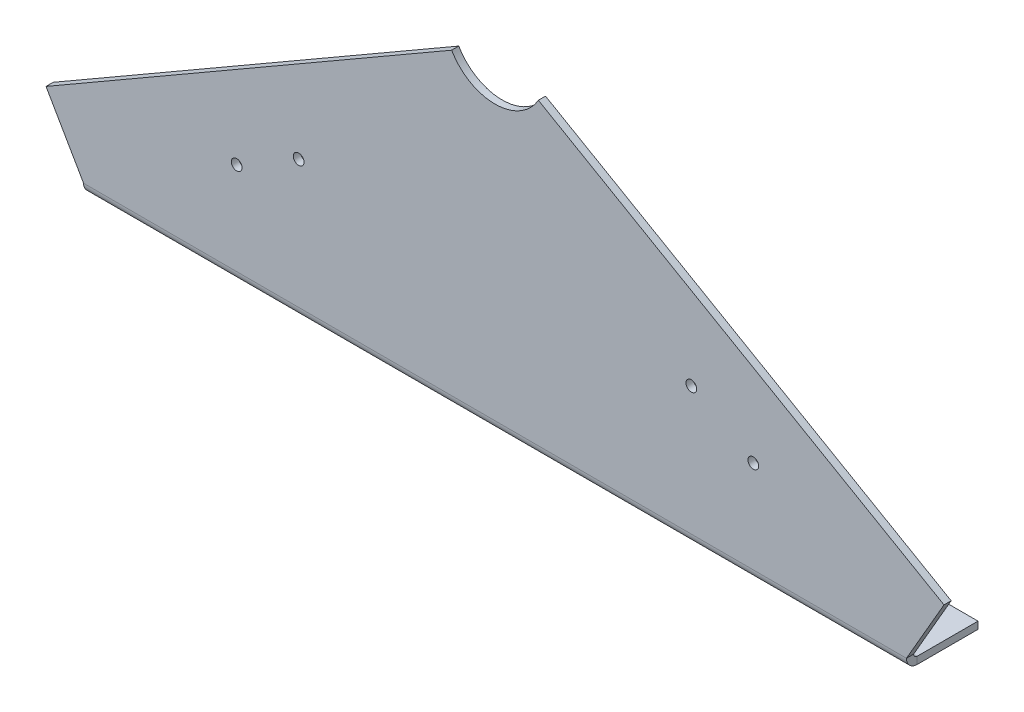
ISO-10303-21;
HEADER;
FILE_DESCRIPTION(('STEP AP214'),'2;1');
FILE_NAME('part.step','',(''),(''),'','','');
FILE_SCHEMA(('AUTOMOTIVE_DESIGN { 1 0 10303 214 1 1 1 1 }'));
ENDSEC;
DATA;
#1=APPLICATION_CONTEXT('core data for automotive mechanical design processes');
#2=APPLICATION_PROTOCOL_DEFINITION('international standard','automotive_design',2000,#1);
#3=PRODUCT_CONTEXT('',#1,'mechanical');
#4=PRODUCT('Part','Part','',(#3));
#5=PRODUCT_RELATED_PRODUCT_CATEGORY('part','',(#4));
#6=PRODUCT_DEFINITION_FORMATION('','',#4);
#7=PRODUCT_DEFINITION_CONTEXT('part definition',#1,'design');
#8=PRODUCT_DEFINITION('design','',#6,#7);
#9=PRODUCT_DEFINITION_SHAPE('','',#8);
#10=(LENGTH_UNIT() NAMED_UNIT(*) SI_UNIT(.MILLI.,.METRE.));
#11=(NAMED_UNIT(*) PLANE_ANGLE_UNIT() SI_UNIT($,.RADIAN.));
#12=(NAMED_UNIT(*) SI_UNIT($,.STERADIAN.) SOLID_ANGLE_UNIT());
#13=UNCERTAINTY_MEASURE_WITH_UNIT(LENGTH_MEASURE(1.E-05),#10,'distance_accuracy_value','');
#14=(GEOMETRIC_REPRESENTATION_CONTEXT(3) GLOBAL_UNCERTAINTY_ASSIGNED_CONTEXT((#13)) GLOBAL_UNIT_ASSIGNED_CONTEXT((#10,
#11,#12)) REPRESENTATION_CONTEXT('',''));
#15=CARTESIAN_POINT('',(0.,0.,0.));
#16=DIRECTION('',(0.,0.,1.));
#17=DIRECTION('',(1.,0.,0.));
#18=AXIS2_PLACEMENT_3D('',#15,#16,#17);
#19=CARTESIAN_POINT('',(0.,0.,-2.));
#20=DIRECTION('',(-0.866025403784436,-0.500000000000005,0.));
#21=DIRECTION('',(0.500000000000005,-0.866025403784436,0.));
#22=AXIS2_PLACEMENT_3D('',#19,#20,#21);
#23=PLANE('',#22);
#24=DIRECTION('',(0.500000000000005,-0.866025403784436,0.));
#25=VECTOR('',#24,1.);
#26=CARTESIAN_POINT('',(0.,0.,0.));
#27=LINE('',#26,#25);
#28=CARTESIAN_POINT('',(-10.4957412624029,18.1791571295786,0.));
#29=VERTEX_POINT('',#28);
#30=CARTESIAN_POINT('',(0.,0.,0.));
#31=VERTEX_POINT('',#30);
#32=EDGE_CURVE('E189',#29,#31,#27,.T.);
#33=ORIENTED_EDGE('',*,*,#32,.F.);
#34=DIRECTION('',(0.,0.,-1.));
#35=VECTOR('',#34,1.);
#36=CARTESIAN_POINT('',(-10.4957412624029,18.1791571295786,-2.));
#37=LINE('',#36,#35);
#38=CARTESIAN_POINT('',(-10.4957412624029,18.1791571295786,-2.));
#39=VERTEX_POINT('',#38);
#40=EDGE_CURVE('E175',#29,#39,#37,.T.);
#41=ORIENTED_EDGE('',*,*,#40,.T.);
#42=DIRECTION('',(0.500000000000005,-0.866025403784436,0.));
#43=VECTOR('',#42,1.);
#44=CARTESIAN_POINT('',(0.,0.,-2.));
#45=LINE('',#44,#43);
#46=CARTESIAN_POINT('',(0.,0.,-2.));
#47=VERTEX_POINT('',#46);
#48=EDGE_CURVE('E219',#39,#47,#45,.T.);
#49=ORIENTED_EDGE('',*,*,#48,.T.);
#50=DIRECTION('',(0.,0.,1.));
#51=VECTOR('',#50,1.);
#52=CARTESIAN_POINT('',(0.,0.,-2.));
#53=LINE('',#52,#51);
#54=EDGE_CURVE('E199',#47,#31,#53,.T.);
#55=ORIENTED_EDGE('',*,*,#54,.T.);
#56=EDGE_LOOP('',(#33,#41,#49,#55));
#57=FACE_BOUND('',#56,.T.);
#58=ADVANCED_FACE('F100',(#57),#23,.T.);
#59=CARTESIAN_POINT('',(250.999999999999,36.3730669589471,-2.));
#60=DIRECTION('',(0.866025403784455,-0.499999999999971,0.));
#61=DIRECTION('',(0.499999999999971,0.866025403784455,0.));
#62=AXIS2_PLACEMENT_3D('',#59,#60,#61);
#63=PLANE('',#62);
#64=DIRECTION('',(0.499999999999971,0.866025403784455,0.));
#65=VECTOR('',#64,1.);
#66=CARTESIAN_POINT('',(250.999999999999,36.3730669589471,-2.));
#67=LINE('',#66,#65);
#68=CARTESIAN_POINT('',(230.,0.,-2.));
#69=VERTEX_POINT('',#68);
#70=CARTESIAN_POINT('',(240.495741262403,18.1791571295807,-2.));
#71=VERTEX_POINT('',#70);
#72=EDGE_CURVE('E206',#69,#71,#67,.T.);
#73=ORIENTED_EDGE('',*,*,#72,.T.);
#74=DIRECTION('',(0.,0.,1.));
#75=VECTOR('',#74,1.);
#76=CARTESIAN_POINT('',(240.495741262403,18.1791571295807,-2.));
#77=LINE('',#76,#75);
#78=CARTESIAN_POINT('',(240.495741262403,18.1791571295807,0.));
#79=VERTEX_POINT('',#78);
#80=EDGE_CURVE('E658',#71,#79,#77,.T.);
#81=ORIENTED_EDGE('',*,*,#80,.T.);
#82=DIRECTION('',(0.499999999999971,0.866025403784455,0.));
#83=VECTOR('',#82,1.);
#84=CARTESIAN_POINT('',(250.999999999999,36.3730669589471,0.));
#85=LINE('',#84,#83);
#86=CARTESIAN_POINT('',(230.,0.,0.));
#87=VERTEX_POINT('',#86);
#88=EDGE_CURVE('E202',#87,#79,#85,.T.);
#89=ORIENTED_EDGE('',*,*,#88,.F.);
#90=DIRECTION('',(0.,0.,1.));
#91=VECTOR('',#90,1.);
#92=CARTESIAN_POINT('',(230.,0.,-2.));
#93=LINE('',#92,#91);
#94=EDGE_CURVE('E215',#69,#87,#93,.T.);
#95=ORIENTED_EDGE('',*,*,#94,.F.);
#96=EDGE_LOOP('',(#73,#81,#89,#95));
#97=FACE_BOUND('',#96,.T.);
#98=ADVANCED_FACE('F102',(#97),#63,.T.);
#99=CARTESIAN_POINT('',(0.,0.,-2.));
#100=DIRECTION('',(0.,0.,-1.));
#101=DIRECTION('',(-1.,0.,0.));
#102=AXIS2_PLACEMENT_3D('',#99,#100,#101);
#103=PLANE('',#102);
#104=CARTESIAN_POINT('',(169.87822173509,35.866025403781,-2.));
#105=DIRECTION('',(0.,0.,-1.));
#106=DIRECTION('',(-1.,0.,0.));
#107=AXIS2_PLACEMENT_3D('',#104,#105,#106);
#108=CIRCLE('',#107,1.5);
#109=CARTESIAN_POINT('',(168.37822173509,35.866025403781,-2.));
#110=VERTEX_POINT('',#109);
#111=EDGE_CURVE('E183',#110,#110,#108,.T.);
#112=ORIENTED_EDGE('',*,*,#111,.F.);
#113=EDGE_LOOP('',(#112));
#114=FACE_BOUND('',#113,.T.);
#115=CARTESIAN_POINT('',(187.19872981078,25.8660254037816,-2.));
#116=DIRECTION('',(0.,0.,-1.));
#117=DIRECTION('',(-1.,0.,0.));
#118=AXIS2_PLACEMENT_3D('',#115,#116,#117);
#119=CIRCLE('',#118,1.5);
#120=CARTESIAN_POINT('',(185.69872981078,25.8660254037816,-2.));
#121=VERTEX_POINT('',#120);
#122=EDGE_CURVE('E647',#121,#121,#119,.T.);
#123=ORIENTED_EDGE('',*,*,#122,.F.);
#124=EDGE_LOOP('',(#123));
#125=FACE_BOUND('',#124,.T.);
#126=CARTESIAN_POINT('',(42.8012701892222,25.866025403784,-2.));
#127=DIRECTION('',(0.,0.,-1.));
#128=DIRECTION('',(-1.,0.,0.));
#129=AXIS2_PLACEMENT_3D('',#126,#127,#128);
#130=CIRCLE('',#129,1.5);
#131=CARTESIAN_POINT('',(41.3012701892222,25.866025403784,-2.));
#132=VERTEX_POINT('',#131);
#133=EDGE_CURVE('E644',#132,#132,#130,.T.);
#134=ORIENTED_EDGE('',*,*,#133,.F.);
#135=EDGE_LOOP('',(#134));
#136=FACE_BOUND('',#135,.T.);
#137=CARTESIAN_POINT('',(60.121778264911,35.866025403784,-2.));
#138=DIRECTION('',(0.,0.,-1.));
#139=DIRECTION('',(-1.,0.,0.));
#140=AXIS2_PLACEMENT_3D('',#137,#138,#139);
#141=CIRCLE('',#140,1.5);
#142=CARTESIAN_POINT('',(58.621778264911,35.866025403784,-2.));
#143=VERTEX_POINT('',#142);
#144=EDGE_CURVE('E225',#143,#143,#141,.T.);
#145=ORIENTED_EDGE('',*,*,#144,.F.);
#146=EDGE_LOOP('',(#145));
#147=FACE_BOUND('',#146,.T.);
#148=ORIENTED_EDGE('',*,*,#48,.F.);
#149=DIRECTION('',(0.866025403784434,0.500000000000008,0.));
#150=VECTOR('',#149,1.);
#151=CARTESIAN_POINT('',(-10.4957412624029,18.1791571295786,-2.));
#152=LINE('',#151,#150);
#153=CARTESIAN_POINT('',(102.879905328467,83.6366172083668,-2.));
#154=VERTEX_POINT('',#153);
#155=EDGE_CURVE('E178',#39,#154,#152,.T.);
#156=ORIENTED_EDGE('',*,*,#155,.T.);
#157=CARTESIAN_POINT('',(115.,90.643992262771,-2.));
#158=DIRECTION('',(0.,0.,-1.));
#159=DIRECTION('',(-1.,0.,0.));
#160=AXIS2_PLACEMENT_3D('',#157,#158,#159);
#161=CIRCLE('',#160,14.);
#162=CARTESIAN_POINT('',(127.120094671533,83.6366172083666,-2.));
#163=VERTEX_POINT('',#162);
#164=EDGE_CURVE('E236',#163,#154,#161,.T.);
#165=ORIENTED_EDGE('',*,*,#164,.F.);
#166=DIRECTION('',(0.866025403784442,-0.499999999999994,0.));
#167=VECTOR('',#166,1.);
#168=CARTESIAN_POINT('',(67.9957412624022,117.77207856479,-2.));
#169=LINE('',#168,#167);
#170=EDGE_CURVE('E123',#163,#71,#169,.T.);
#171=ORIENTED_EDGE('',*,*,#170,.T.);
#172=ORIENTED_EDGE('',*,*,#72,.F.);
#173=DIRECTION('',(1.,0.,0.));
#174=VECTOR('',#173,1.);
#175=CARTESIAN_POINT('',(230.,0.,-2.));
#176=LINE('',#175,#174);
#177=EDGE_CURVE('E201',#47,#69,#176,.T.);
#178=ORIENTED_EDGE('',*,*,#177,.F.);
#179=EDGE_LOOP('',(#148,#156,#165,#171,#172,#178));
#180=FACE_BOUND('',#179,.T.);
#181=ADVANCED_FACE('F399',(#114,#125,#136,#147,#180),#103,.T.);
#182=CARTESIAN_POINT('',(0.,0.,0.));
#183=DIRECTION('',(0.,0.,-1.));
#184=DIRECTION('',(-1.,0.,0.));
#185=AXIS2_PLACEMENT_3D('',#182,#183,#184);
#186=PLANE('',#185);
#187=CARTESIAN_POINT('',(169.87822173509,35.866025403781,0.));
#188=DIRECTION('',(0.,0.,-1.));
#189=DIRECTION('',(-1.,0.,0.));
#190=AXIS2_PLACEMENT_3D('',#187,#188,#189);
#191=CIRCLE('',#190,1.5);
#192=CARTESIAN_POINT('',(168.37822173509,35.866025403781,0.));
#193=VERTEX_POINT('',#192);
#194=EDGE_CURVE('E220',#193,#193,#191,.T.);
#195=ORIENTED_EDGE('',*,*,#194,.T.);
#196=EDGE_LOOP('',(#195));
#197=FACE_BOUND('',#196,.T.);
#198=CARTESIAN_POINT('',(187.19872981078,25.8660254037816,0.));
#199=DIRECTION('',(0.,0.,-1.));
#200=DIRECTION('',(-1.,0.,0.));
#201=AXIS2_PLACEMENT_3D('',#198,#199,#200);
#202=CIRCLE('',#201,1.5);
#203=CARTESIAN_POINT('',(185.69872981078,25.8660254037816,0.));
#204=VERTEX_POINT('',#203);
#205=EDGE_CURVE('E224',#204,#204,#202,.T.);
#206=ORIENTED_EDGE('',*,*,#205,.T.);
#207=EDGE_LOOP('',(#206));
#208=FACE_BOUND('',#207,.T.);
#209=CARTESIAN_POINT('',(42.8012701892222,25.866025403784,0.));
#210=DIRECTION('',(0.,0.,-1.));
#211=DIRECTION('',(-1.,0.,0.));
#212=AXIS2_PLACEMENT_3D('',#209,#210,#211);
#213=CIRCLE('',#212,1.5);
#214=CARTESIAN_POINT('',(41.3012701892222,25.866025403784,0.));
#215=VERTEX_POINT('',#214);
#216=EDGE_CURVE('E229',#215,#215,#213,.T.);
#217=ORIENTED_EDGE('',*,*,#216,.T.);
#218=EDGE_LOOP('',(#217));
#219=FACE_BOUND('',#218,.T.);
#220=CARTESIAN_POINT('',(60.121778264911,35.866025403784,0.));
#221=DIRECTION('',(0.,0.,-1.));
#222=DIRECTION('',(-1.,0.,0.));
#223=AXIS2_PLACEMENT_3D('',#220,#221,#222);
#224=CIRCLE('',#223,1.5);
#225=CARTESIAN_POINT('',(58.621778264911,35.866025403784,0.));
#226=VERTEX_POINT('',#225);
#227=EDGE_CURVE('E233',#226,#226,#224,.T.);
#228=ORIENTED_EDGE('',*,*,#227,.T.);
#229=EDGE_LOOP('',(#228));
#230=FACE_BOUND('',#229,.T.);
#231=DIRECTION('',(0.866025403784434,0.500000000000008,0.));
#232=VECTOR('',#231,1.);
#233=CARTESIAN_POINT('',(-14.8258682813249,15.6791571295786,0.));
#234=LINE('',#233,#232);
#235=CARTESIAN_POINT('',(102.879905328467,83.6366172083668,0.));
#236=VERTEX_POINT('',#235);
#237=EDGE_CURVE('E115',#29,#236,#234,.T.);
#238=ORIENTED_EDGE('',*,*,#237,.F.);
#239=ORIENTED_EDGE('',*,*,#32,.T.);
#240=DIRECTION('',(1.,0.,0.));
#241=VECTOR('',#240,1.);
#242=CARTESIAN_POINT('',(230.,0.,0.));
#243=LINE('',#242,#241);
#244=EDGE_CURVE('E209',#31,#87,#243,.T.);
#245=ORIENTED_EDGE('',*,*,#244,.T.);
#246=ORIENTED_EDGE('',*,*,#88,.T.);
#247=DIRECTION('',(0.866025403784442,-0.499999999999994,0.));
#248=VECTOR('',#247,1.);
#249=CARTESIAN_POINT('',(115.,90.6341571295798,0.));
#250=LINE('',#249,#248);
#251=CARTESIAN_POINT('',(127.120094671533,83.6366172083666,0.));
#252=VERTEX_POINT('',#251);
#253=EDGE_CURVE('E195',#252,#79,#250,.T.);
#254=ORIENTED_EDGE('',*,*,#253,.F.);
#255=CARTESIAN_POINT('',(115.,90.643992262771,0.));
#256=DIRECTION('',(0.,0.,-1.));
#257=DIRECTION('',(-1.,0.,0.));
#258=AXIS2_PLACEMENT_3D('',#255,#256,#257);
#259=CIRCLE('',#258,14.);
#260=EDGE_CURVE('E193',#236,#252,#259,.F.);
#261=ORIENTED_EDGE('',*,*,#260,.F.);
#262=EDGE_LOOP('',(#238,#239,#245,#246,#254,#261));
#263=FACE_BOUND('',#262,.T.);
#264=ADVANCED_FACE('F187',(#197,#208,#219,#230,#263),#186,.F.);
#265=CARTESIAN_POINT('',(115.,90.643992262771,0.00100000000031759));
#266=DIRECTION('',(0.,0.,-1.));
#267=DIRECTION('',(-1.,0.,0.));
#268=AXIS2_PLACEMENT_3D('',#265,#266,#267);
#269=CYLINDRICAL_SURFACE('',#268,14.);
#270=DIRECTION('',(0.,0.,-1.));
#271=VECTOR('',#270,1.);
#272=CARTESIAN_POINT('',(102.879905328467,83.6366172083668,0.00100000000031759));
#273=LINE('',#272,#271);
#274=EDGE_CURVE('E13',#236,#154,#273,.T.);
#275=ORIENTED_EDGE('',*,*,#274,.F.);
#276=ORIENTED_EDGE('',*,*,#260,.T.);
#277=DIRECTION('',(0.,0.,-1.));
#278=VECTOR('',#277,1.);
#279=CARTESIAN_POINT('',(127.120094671533,83.6366172083666,0.00100000000031759));
#280=LINE('',#279,#278);
#281=EDGE_CURVE('E109',#163,#252,#280,.F.);
#282=ORIENTED_EDGE('',*,*,#281,.F.);
#283=ORIENTED_EDGE('',*,*,#164,.T.);
#284=EDGE_LOOP('',(#275,#276,#282,#283));
#285=FACE_BOUND('',#284,.T.);
#286=ADVANCED_FACE('F246',(#285),#269,.F.);
#287=CARTESIAN_POINT('',(230.,0.,-3.));
#288=DIRECTION('',(1.,0.,0.));
#289=DIRECTION('',(0.,0.,-1.));
#290=AXIS2_PLACEMENT_3D('',#287,#288,#289);
#291=PLANE('',#290);
#292=DIRECTION('',(0.,1.,0.));
#293=VECTOR('',#292,1.);
#294=CARTESIAN_POINT('',(230.,-3.,-2.99999999999999));
#295=LINE('',#294,#293);
#296=CARTESIAN_POINT('',(230.,-0.999999999999999,-3.));
#297=VERTEX_POINT('',#296);
#298=CARTESIAN_POINT('',(230.,-3.,-2.99999999999999));
#299=VERTEX_POINT('',#298);
#300=EDGE_CURVE('E262',#297,#299,#295,.F.);
#301=ORIENTED_EDGE('',*,*,#300,.F.);
#302=CARTESIAN_POINT('',(230.,0.,-3.));
#303=DIRECTION('',(-1.,0.,0.));
#304=DIRECTION('',(0.,0.,1.));
#305=AXIS2_PLACEMENT_3D('',#302,#303,#304);
#306=CIRCLE('',#305,0.999999999999999);
#307=EDGE_CURVE('E336',#69,#297,#306,.F.);
#308=ORIENTED_EDGE('',*,*,#307,.F.);
#309=ORIENTED_EDGE('',*,*,#94,.T.);
#310=CARTESIAN_POINT('',(230.,0.,-3.));
#311=DIRECTION('',(-1.,0.,0.));
#312=DIRECTION('',(0.,0.,1.));
#313=AXIS2_PLACEMENT_3D('',#310,#311,#312);
#314=CIRCLE('',#313,3.);
#315=EDGE_CURVE('E328',#87,#299,#314,.F.);
#316=ORIENTED_EDGE('',*,*,#315,.T.);
#317=EDGE_LOOP('',(#301,#308,#309,#316));
#318=FACE_BOUND('',#317,.T.);
#319=ADVANCED_FACE('F373',(#318),#291,.T.);
#320=CARTESIAN_POINT('',(0.,0.,-3.));
#321=DIRECTION('',(1.,0.,0.));
#322=DIRECTION('',(0.,0.,-1.));
#323=AXIS2_PLACEMENT_3D('',#320,#321,#322);
#324=PLANE('',#323);
#325=CARTESIAN_POINT('',(0.,0.,-3.));
#326=DIRECTION('',(-1.,0.,0.));
#327=DIRECTION('',(0.,0.,1.));
#328=AXIS2_PLACEMENT_3D('',#325,#326,#327);
#329=CIRCLE('',#328,0.999999999999999);
#330=CARTESIAN_POINT('',(0.,-0.999999999999999,-3.));
#331=VERTEX_POINT('',#330);
#332=EDGE_CURVE('E290',#331,#47,#329,.T.);
#333=ORIENTED_EDGE('',*,*,#332,.F.);
#334=DIRECTION('',(0.,1.,0.));
#335=VECTOR('',#334,1.);
#336=CARTESIAN_POINT('',(0.,-1.,-3.));
#337=LINE('',#336,#335);
#338=CARTESIAN_POINT('',(0.,-3.,-2.99999999999999));
#339=VERTEX_POINT('',#338);
#340=EDGE_CURVE('E318',#331,#339,#337,.F.);
#341=ORIENTED_EDGE('',*,*,#340,.T.);
#342=CARTESIAN_POINT('',(0.,0.,-3.));
#343=DIRECTION('',(-1.,0.,0.));
#344=DIRECTION('',(0.,0.,1.));
#345=AXIS2_PLACEMENT_3D('',#342,#343,#344);
#346=CIRCLE('',#345,3.);
#347=EDGE_CURVE('E332',#339,#31,#346,.T.);
#348=ORIENTED_EDGE('',*,*,#347,.T.);
#349=ORIENTED_EDGE('',*,*,#54,.F.);
#350=EDGE_LOOP('',(#333,#341,#348,#349));
#351=FACE_BOUND('',#350,.T.);
#352=ADVANCED_FACE('F352',(#351),#324,.F.);
#353=CARTESIAN_POINT('',(0.,0.,-3.));
#354=DIRECTION('',(-1.,0.,0.));
#355=DIRECTION('',(0.,-1.,0.));
#356=AXIS2_PLACEMENT_3D('',#353,#354,#355);
#357=CYLINDRICAL_SURFACE('',#356,3.);
#358=ORIENTED_EDGE('',*,*,#244,.F.);
#359=ORIENTED_EDGE('',*,*,#347,.F.);
#360=DIRECTION('',(-1.,0.,0.));
#361=VECTOR('',#360,1.);
#362=CARTESIAN_POINT('',(230.,-3.,-2.99999999999999));
#363=LINE('',#362,#361);
#364=EDGE_CURVE('E315',#339,#299,#363,.F.);
#365=ORIENTED_EDGE('',*,*,#364,.T.);
#366=ORIENTED_EDGE('',*,*,#315,.F.);
#367=EDGE_LOOP('',(#358,#359,#365,#366));
#368=FACE_BOUND('',#367,.T.);
#369=ADVANCED_FACE('F349',(#368),#357,.T.);
#370=CARTESIAN_POINT('',(0.,0.,-3.));
#371=DIRECTION('',(-1.,0.,0.));
#372=DIRECTION('',(0.,-1.,0.));
#373=AXIS2_PLACEMENT_3D('',#370,#371,#372);
#374=CYLINDRICAL_SURFACE('',#373,0.999999999999999);
#375=ORIENTED_EDGE('',*,*,#177,.T.);
#376=ORIENTED_EDGE('',*,*,#307,.T.);
#377=DIRECTION('',(-1.,0.,0.));
#378=VECTOR('',#377,1.);
#379=CARTESIAN_POINT('',(230.,-0.999999999999999,-3.));
#380=LINE('',#379,#378);
#381=EDGE_CURVE('E322',#297,#331,#380,.T.);
#382=ORIENTED_EDGE('',*,*,#381,.T.);
#383=ORIENTED_EDGE('',*,*,#332,.T.);
#384=EDGE_LOOP('',(#375,#376,#382,#383));
#385=FACE_BOUND('',#384,.T.);
#386=ADVANCED_FACE('F377',(#385),#374,.F.);
#387=CARTESIAN_POINT('',(0.,-3.00000000000006,-20.));
#388=DIRECTION('',(1.,0.,0.));
#389=DIRECTION('',(0.,0.,-1.));
#390=AXIS2_PLACEMENT_3D('',#387,#388,#389);
#391=PLANE('',#390);
#392=ORIENTED_EDGE('',*,*,#340,.F.);
#393=DIRECTION('',(0.,0.,1.));
#394=VECTOR('',#393,1.);
#395=CARTESIAN_POINT('',(0.,-1.00000000000006,-20.));
#396=LINE('',#395,#394);
#397=CARTESIAN_POINT('',(0.,-1.00000000000006,-20.));
#398=VERTEX_POINT('',#397);
#399=EDGE_CURVE('E312',#331,#398,#396,.F.);
#400=ORIENTED_EDGE('',*,*,#399,.T.);
#401=DIRECTION('',(0.,1.,0.));
#402=VECTOR('',#401,1.);
#403=CARTESIAN_POINT('',(0.,-3.00000000000006,-20.));
#404=LINE('',#403,#402);
#405=CARTESIAN_POINT('',(0.,-3.00000000000006,-20.));
#406=VERTEX_POINT('',#405);
#407=EDGE_CURVE('E286',#406,#398,#404,.T.);
#408=ORIENTED_EDGE('',*,*,#407,.F.);
#409=DIRECTION('',(0.,0.,-1.));
#410=VECTOR('',#409,1.);
#411=CARTESIAN_POINT('',(0.,-2.99999999999999,0.));
#412=LINE('',#411,#410);
#413=EDGE_CURVE('E302',#339,#406,#412,.T.);
#414=ORIENTED_EDGE('',*,*,#413,.F.);
#415=EDGE_LOOP('',(#392,#400,#408,#414));
#416=FACE_BOUND('',#415,.T.);
#417=ADVANCED_FACE('F363',(#416),#391,.F.);
#418=CARTESIAN_POINT('',(230.,-3.,-1.99999999999999));
#419=DIRECTION('',(-1.,0.,0.));
#420=DIRECTION('',(0.,-1.,0.));
#421=AXIS2_PLACEMENT_3D('',#418,#419,#420);
#422=PLANE('',#421);
#423=ORIENTED_EDGE('',*,*,#300,.T.);
#424=DIRECTION('',(0.,0.,1.));
#425=VECTOR('',#424,1.);
#426=CARTESIAN_POINT('',(230.,-2.99999999999999,0.));
#427=LINE('',#426,#425);
#428=CARTESIAN_POINT('',(230.,-3.00000000000006,-20.));
#429=VERTEX_POINT('',#428);
#430=EDGE_CURVE('E295',#429,#299,#427,.T.);
#431=ORIENTED_EDGE('',*,*,#430,.F.);
#432=DIRECTION('',(0.,1.,0.));
#433=VECTOR('',#432,1.);
#434=CARTESIAN_POINT('',(230.,-3.00000000000006,-20.));
#435=LINE('',#434,#433);
#436=CARTESIAN_POINT('',(230.,-1.00000000000006,-20.));
#437=VERTEX_POINT('',#436);
#438=EDGE_CURVE('E291',#429,#437,#435,.T.);
#439=ORIENTED_EDGE('',*,*,#438,.T.);
#440=DIRECTION('',(0.,0.,-1.));
#441=VECTOR('',#440,1.);
#442=CARTESIAN_POINT('',(230.,-0.999999999999995,-2.));
#443=LINE('',#442,#441);
#444=EDGE_CURVE('E305',#437,#297,#443,.F.);
#445=ORIENTED_EDGE('',*,*,#444,.T.);
#446=EDGE_LOOP('',(#423,#431,#439,#445));
#447=FACE_BOUND('',#446,.T.);
#448=ADVANCED_FACE('F370',(#447),#422,.F.);
#449=CARTESIAN_POINT('',(0.,-2.99999999999999,0.));
#450=DIRECTION('',(0.,1.,0.));
#451=DIRECTION('',(0.,0.,1.));
#452=AXIS2_PLACEMENT_3D('',#449,#450,#451);
#453=PLANE('',#452);
#454=CARTESIAN_POINT('',(222.,-3.00000000000002,-11.5));
#455=DIRECTION('',(0.,-1.,0.));
#456=DIRECTION('',(0.,0.,-1.));
#457=AXIS2_PLACEMENT_3D('',#454,#455,#456);
#458=CIRCLE('',#457,2.);
#459=CARTESIAN_POINT('',(222.,-3.00000000000003,-13.5));
#460=VERTEX_POINT('',#459);
#461=EDGE_CURVE('E258',#460,#460,#458,.T.);
#462=ORIENTED_EDGE('',*,*,#461,.F.);
#463=EDGE_LOOP('',(#462));
#464=FACE_BOUND('',#463,.T.);
#465=CARTESIAN_POINT('',(212.,-3.00000000000002,-11.5));
#466=DIRECTION('',(0.,-1.,0.));
#467=DIRECTION('',(0.,0.,-1.));
#468=AXIS2_PLACEMENT_3D('',#465,#466,#467);
#469=CIRCLE('',#468,2.00000000000003);
#470=CARTESIAN_POINT('',(212.,-3.00000000000003,-13.5));
#471=VERTEX_POINT('',#470);
#472=EDGE_CURVE('E267',#471,#471,#469,.T.);
#473=ORIENTED_EDGE('',*,*,#472,.F.);
#474=EDGE_LOOP('',(#473));
#475=FACE_BOUND('',#474,.T.);
#476=CARTESIAN_POINT('',(18.0000000000005,-3.00000000000003,-11.5));
#477=DIRECTION('',(0.,-1.,0.));
#478=DIRECTION('',(0.,0.,-1.));
#479=AXIS2_PLACEMENT_3D('',#476,#477,#478);
#480=CIRCLE('',#479,2.);
#481=CARTESIAN_POINT('',(18.0000000000005,-3.00000000000004,-13.5));
#482=VERTEX_POINT('',#481);
#483=EDGE_CURVE('E275',#482,#482,#480,.T.);
#484=ORIENTED_EDGE('',*,*,#483,.F.);
#485=EDGE_LOOP('',(#484));
#486=FACE_BOUND('',#485,.T.);
#487=CARTESIAN_POINT('',(8.00000000000051,-3.00000000000003,-11.5));
#488=DIRECTION('',(0.,-1.,0.));
#489=DIRECTION('',(0.,0.,-1.));
#490=AXIS2_PLACEMENT_3D('',#487,#488,#489);
#491=CIRCLE('',#490,2.);
#492=CARTESIAN_POINT('',(8.00000000000051,-3.00000000000004,-13.5));
#493=VERTEX_POINT('',#492);
#494=EDGE_CURVE('E253',#493,#493,#491,.T.);
#495=ORIENTED_EDGE('',*,*,#494,.F.);
#496=EDGE_LOOP('',(#495));
#497=FACE_BOUND('',#496,.T.);
#498=ORIENTED_EDGE('',*,*,#364,.F.);
#499=ORIENTED_EDGE('',*,*,#413,.T.);
#500=DIRECTION('',(1.,0.,0.));
#501=VECTOR('',#500,1.);
#502=CARTESIAN_POINT('',(0.,-3.00000000000006,-20.));
#503=LINE('',#502,#501);
#504=EDGE_CURVE('E299',#406,#429,#503,.T.);
#505=ORIENTED_EDGE('',*,*,#504,.T.);
#506=ORIENTED_EDGE('',*,*,#430,.T.);
#507=EDGE_LOOP('',(#498,#499,#505,#506));
#508=FACE_BOUND('',#507,.T.);
#509=ADVANCED_FACE('F359',(#464,#475,#486,#497,#508),#453,.F.);
#510=CARTESIAN_POINT('',(0.,-0.99999999999999,0.));
#511=DIRECTION('',(0.,1.,0.));
#512=DIRECTION('',(0.,0.,1.));
#513=AXIS2_PLACEMENT_3D('',#510,#511,#512);
#514=PLANE('',#513);
#515=CARTESIAN_POINT('',(222.,-1.00000000000003,-11.5));
#516=DIRECTION('',(0.,1.,0.));
#517=DIRECTION('',(0.,0.,1.));
#518=AXIS2_PLACEMENT_3D('',#515,#516,#517);
#519=CIRCLE('',#518,2.);
#520=CARTESIAN_POINT('',(222.,-1.00000000000002,-9.5));
#521=VERTEX_POINT('',#520);
#522=EDGE_CURVE('E263',#521,#521,#519,.F.);
#523=ORIENTED_EDGE('',*,*,#522,.T.);
#524=EDGE_LOOP('',(#523));
#525=FACE_BOUND('',#524,.T.);
#526=CARTESIAN_POINT('',(212.,-1.00000000000003,-11.5));
#527=DIRECTION('',(0.,1.,0.));
#528=DIRECTION('',(0.,0.,1.));
#529=AXIS2_PLACEMENT_3D('',#526,#527,#528);
#530=CIRCLE('',#529,2.00000000000003);
#531=CARTESIAN_POINT('',(212.,-1.00000000000002,-9.49999999999997));
#532=VERTEX_POINT('',#531);
#533=EDGE_CURVE('E271',#532,#532,#530,.F.);
#534=ORIENTED_EDGE('',*,*,#533,.T.);
#535=EDGE_LOOP('',(#534));
#536=FACE_BOUND('',#535,.T.);
#537=CARTESIAN_POINT('',(18.0000000000005,-1.00000000000003,-11.5));
#538=DIRECTION('',(0.,1.,0.));
#539=DIRECTION('',(0.,0.,1.));
#540=AXIS2_PLACEMENT_3D('',#537,#538,#539);
#541=CIRCLE('',#540,2.);
#542=CARTESIAN_POINT('',(18.0000000000005,-1.00000000000002,-9.50000000000004));
#543=VERTEX_POINT('',#542);
#544=EDGE_CURVE('E279',#543,#543,#541,.F.);
#545=ORIENTED_EDGE('',*,*,#544,.T.);
#546=EDGE_LOOP('',(#545));
#547=FACE_BOUND('',#546,.T.);
#548=CARTESIAN_POINT('',(8.00000000000051,-1.00000000000003,-11.5));
#549=DIRECTION('',(0.,1.,0.));
#550=DIRECTION('',(0.,0.,1.));
#551=AXIS2_PLACEMENT_3D('',#548,#549,#550);
#552=CIRCLE('',#551,2.);
#553=CARTESIAN_POINT('',(8.00000000000051,-1.00000000000002,-9.50000000000004));
#554=VERTEX_POINT('',#553);
#555=EDGE_CURVE('E248',#554,#554,#552,.F.);
#556=ORIENTED_EDGE('',*,*,#555,.T.);
#557=EDGE_LOOP('',(#556));
#558=FACE_BOUND('',#557,.T.);
#559=ORIENTED_EDGE('',*,*,#399,.F.);
#560=ORIENTED_EDGE('',*,*,#381,.F.);
#561=ORIENTED_EDGE('',*,*,#444,.F.);
#562=DIRECTION('',(-1.,0.,0.));
#563=VECTOR('',#562,1.);
#564=CARTESIAN_POINT('',(230.,-1.00000000000006,-20.));
#565=LINE('',#564,#563);
#566=EDGE_CURVE('E309',#398,#437,#565,.F.);
#567=ORIENTED_EDGE('',*,*,#566,.F.);
#568=EDGE_LOOP('',(#559,#560,#561,#567));
#569=FACE_BOUND('',#568,.T.);
#570=ADVANCED_FACE('F380',(#525,#536,#547,#558,#569),#514,.T.);
#571=CARTESIAN_POINT('',(230.,-3.00000000000006,-20.));
#572=DIRECTION('',(0.,0.,1.));
#573=DIRECTION('',(0.,-1.,0.));
#574=AXIS2_PLACEMENT_3D('',#571,#572,#573);
#575=PLANE('',#574);
#576=ORIENTED_EDGE('',*,*,#566,.T.);
#577=ORIENTED_EDGE('',*,*,#438,.F.);
#578=ORIENTED_EDGE('',*,*,#504,.F.);
#579=ORIENTED_EDGE('',*,*,#407,.T.);
#580=EDGE_LOOP('',(#576,#577,#578,#579));
#581=FACE_BOUND('',#580,.T.);
#582=ADVANCED_FACE('F366',(#581),#575,.F.);
#583=CARTESIAN_POINT('',(8.0000000000005,237.059909829369,-11.5000000000009));
#584=DIRECTION('',(0.,-1.,0.));
#585=DIRECTION('',(0.,0.,-1.));
#586=AXIS2_PLACEMENT_3D('',#583,#584,#585);
#587=CYLINDRICAL_SURFACE('',#586,2.);
#588=ORIENTED_EDGE('',*,*,#555,.F.);
#589=EDGE_LOOP('',(#588));
#590=FACE_BOUND('',#589,.T.);
#591=ORIENTED_EDGE('',*,*,#494,.T.);
#592=EDGE_LOOP('',(#591));
#593=FACE_BOUND('',#592,.T.);
#594=ADVANCED_FACE('F388',(#590,#593),#587,.F.);
#595=CARTESIAN_POINT('',(18.0000000000005,237.059909829369,-11.5000000000009));
#596=DIRECTION('',(0.,-1.,0.));
#597=DIRECTION('',(0.,0.,-1.));
#598=AXIS2_PLACEMENT_3D('',#595,#596,#597);
#599=CYLINDRICAL_SURFACE('',#598,2.);
#600=ORIENTED_EDGE('',*,*,#544,.F.);
#601=EDGE_LOOP('',(#600));
#602=FACE_BOUND('',#601,.T.);
#603=ORIENTED_EDGE('',*,*,#483,.T.);
#604=EDGE_LOOP('',(#603));
#605=FACE_BOUND('',#604,.T.);
#606=ADVANCED_FACE('F444',(#602,#605),#599,.F.);
#607=CARTESIAN_POINT('',(212.,237.059909829369,-11.5000000000008));
#608=DIRECTION('',(0.,-1.,0.));
#609=DIRECTION('',(0.,0.,-1.));
#610=AXIS2_PLACEMENT_3D('',#607,#608,#609);
#611=CYLINDRICAL_SURFACE('',#610,2.00000000000003);
#612=ORIENTED_EDGE('',*,*,#533,.F.);
#613=EDGE_LOOP('',(#612));
#614=FACE_BOUND('',#613,.T.);
#615=ORIENTED_EDGE('',*,*,#472,.T.);
#616=EDGE_LOOP('',(#615));
#617=FACE_BOUND('',#616,.T.);
#618=ADVANCED_FACE('F455',(#614,#617),#611,.F.);
#619=CARTESIAN_POINT('',(222.,237.059909829369,-11.5000000000008));
#620=DIRECTION('',(0.,-1.,0.));
#621=DIRECTION('',(0.,0.,-1.));
#622=AXIS2_PLACEMENT_3D('',#619,#620,#621);
#623=CYLINDRICAL_SURFACE('',#622,2.);
#624=ORIENTED_EDGE('',*,*,#522,.F.);
#625=EDGE_LOOP('',(#624));
#626=FACE_BOUND('',#625,.T.);
#627=ORIENTED_EDGE('',*,*,#461,.T.);
#628=EDGE_LOOP('',(#627));
#629=FACE_BOUND('',#628,.T.);
#630=ADVANCED_FACE('F466',(#626,#629),#623,.F.);
#631=CARTESIAN_POINT('',(169.87822173509,35.866025403781,8.));
#632=DIRECTION('',(0.,0.,-1.));
#633=DIRECTION('',(-1.,0.,0.));
#634=AXIS2_PLACEMENT_3D('',#631,#632,#633);
#635=CYLINDRICAL_SURFACE('',#634,1.5);
#636=ORIENTED_EDGE('',*,*,#111,.T.);
#637=EDGE_LOOP('',(#636));
#638=FACE_BOUND('',#637,.T.);
#639=ORIENTED_EDGE('',*,*,#194,.F.);
#640=EDGE_LOOP('',(#639));
#641=FACE_BOUND('',#640,.T.);
#642=ADVANCED_FACE('F477',(#638,#641),#635,.F.);
#643=CARTESIAN_POINT('',(187.19872981078,25.8660254037816,8.));
#644=DIRECTION('',(0.,0.,-1.));
#645=DIRECTION('',(-1.,0.,0.));
#646=AXIS2_PLACEMENT_3D('',#643,#644,#645);
#647=CYLINDRICAL_SURFACE('',#646,1.5);
#648=ORIENTED_EDGE('',*,*,#122,.T.);
#649=EDGE_LOOP('',(#648));
#650=FACE_BOUND('',#649,.T.);
#651=ORIENTED_EDGE('',*,*,#205,.F.);
#652=EDGE_LOOP('',(#651));
#653=FACE_BOUND('',#652,.T.);
#654=ADVANCED_FACE('F488',(#650,#653),#647,.F.);
#655=CARTESIAN_POINT('',(42.8012701892222,25.866025403784,8.));
#656=DIRECTION('',(0.,0.,-1.));
#657=DIRECTION('',(-1.,0.,0.));
#658=AXIS2_PLACEMENT_3D('',#655,#656,#657);
#659=CYLINDRICAL_SURFACE('',#658,1.5);
#660=ORIENTED_EDGE('',*,*,#133,.T.);
#661=EDGE_LOOP('',(#660));
#662=FACE_BOUND('',#661,.T.);
#663=ORIENTED_EDGE('',*,*,#216,.F.);
#664=EDGE_LOOP('',(#663));
#665=FACE_BOUND('',#664,.T.);
#666=ADVANCED_FACE('F499',(#662,#665),#659,.F.);
#667=CARTESIAN_POINT('',(60.121778264911,35.866025403784,8.));
#668=DIRECTION('',(0.,0.,-1.));
#669=DIRECTION('',(-1.,0.,0.));
#670=AXIS2_PLACEMENT_3D('',#667,#668,#669);
#671=CYLINDRICAL_SURFACE('',#670,1.5);
#672=ORIENTED_EDGE('',*,*,#144,.T.);
#673=EDGE_LOOP('',(#672));
#674=FACE_BOUND('',#673,.T.);
#675=ORIENTED_EDGE('',*,*,#227,.F.);
#676=EDGE_LOOP('',(#675));
#677=FACE_BOUND('',#676,.T.);
#678=ADVANCED_FACE('F509',(#674,#677),#671,.F.);
#679=CARTESIAN_POINT('',(115.,90.6341571295798,0.));
#680=DIRECTION('',(0.499999999999994,0.866025403784442,0.));
#681=DIRECTION('',(-0.866025403784442,0.499999999999994,0.));
#682=AXIS2_PLACEMENT_3D('',#679,#680,#681);
#683=PLANE('',#682);
#684=ORIENTED_EDGE('',*,*,#170,.F.);
#685=ORIENTED_EDGE('',*,*,#281,.T.);
#686=ORIENTED_EDGE('',*,*,#253,.T.);
#687=ORIENTED_EDGE('',*,*,#80,.F.);
#688=EDGE_LOOP('',(#684,#685,#686,#687));
#689=FACE_BOUND('',#688,.T.);
#690=ADVANCED_FACE('F238',(#689),#683,.T.);
#691=CARTESIAN_POINT('',(-14.8258682813249,15.6791571295786,0.));
#692=DIRECTION('',(-0.500000000000008,0.866025403784434,0.));
#693=DIRECTION('',(-0.866025403784434,-0.500000000000008,0.));
#694=AXIS2_PLACEMENT_3D('',#691,#692,#693);
#695=PLANE('',#694);
#696=ORIENTED_EDGE('',*,*,#237,.T.);
#697=ORIENTED_EDGE('',*,*,#274,.T.);
#698=ORIENTED_EDGE('',*,*,#155,.F.);
#699=ORIENTED_EDGE('',*,*,#40,.F.);
#700=EDGE_LOOP('',(#696,#697,#698,#699));
#701=FACE_BOUND('',#700,.T.);
#702=ADVANCED_FACE('F176',(#701),#695,.T.);
#703=CLOSED_SHELL('',(#58,#98,#181,#264,#286,#319,#352,#369,#386,#417,#448,#509,#570,#582,#594,
#606,#618,#630,#642,#654,#666,#678,#690,#702));
#704=MANIFOLD_SOLID_BREP('B2',#703);
#705=ADVANCED_BREP_SHAPE_REPRESENTATION('',(#18,#704),#14);
#706=SHAPE_DEFINITION_REPRESENTATION(#9,#705);
ENDSEC;
END-ISO-10303-21;
